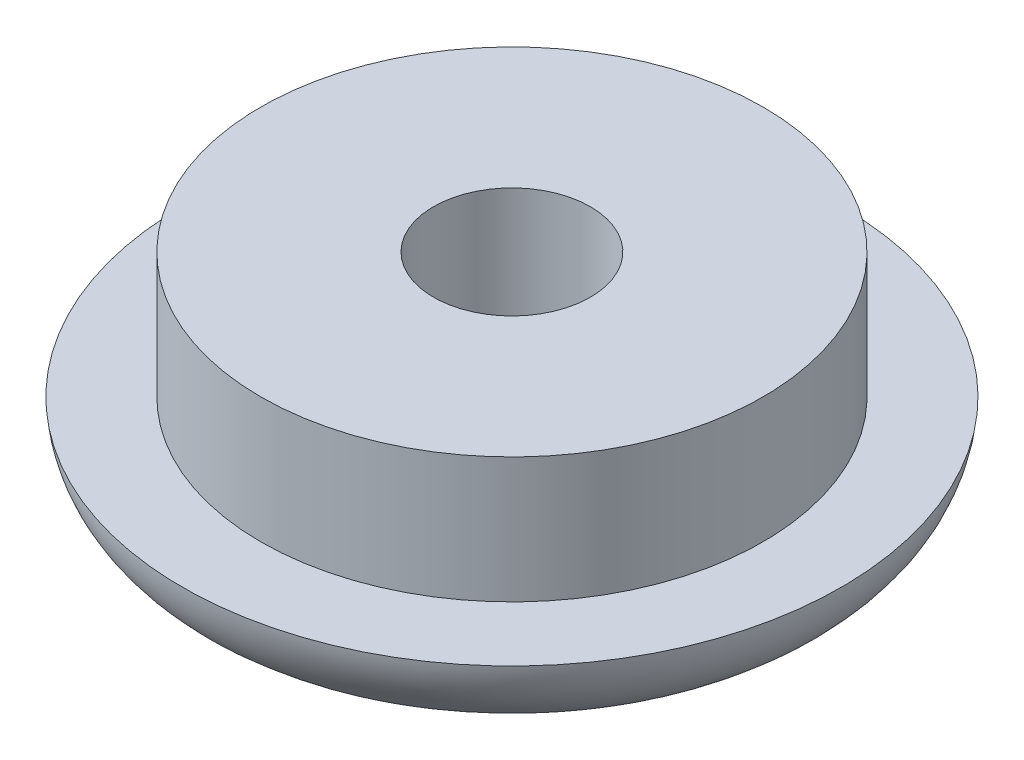
ISO-10303-21;
HEADER;
FILE_DESCRIPTION(('STEP AP214'),'2;1');
FILE_NAME('part.step','',(''),(''),'','','');
FILE_SCHEMA(('AUTOMOTIVE_DESIGN { 1 0 10303 214 1 1 1 1 }'));
ENDSEC;
DATA;
#1=APPLICATION_CONTEXT('core data for automotive mechanical design processes');
#2=APPLICATION_PROTOCOL_DEFINITION('international standard','automotive_design',2000,#1);
#3=PRODUCT_CONTEXT('',#1,'mechanical');
#4=PRODUCT('Part','Part','',(#3));
#5=PRODUCT_RELATED_PRODUCT_CATEGORY('part','',(#4));
#6=PRODUCT_DEFINITION_FORMATION('','',#4);
#7=PRODUCT_DEFINITION_CONTEXT('part definition',#1,'design');
#8=PRODUCT_DEFINITION('design','',#6,#7);
#9=PRODUCT_DEFINITION_SHAPE('','',#8);
#10=(LENGTH_UNIT() NAMED_UNIT(*) SI_UNIT(.MILLI.,.METRE.));
#11=(NAMED_UNIT(*) PLANE_ANGLE_UNIT() SI_UNIT($,.RADIAN.));
#12=(NAMED_UNIT(*) SI_UNIT($,.STERADIAN.) SOLID_ANGLE_UNIT());
#13=UNCERTAINTY_MEASURE_WITH_UNIT(LENGTH_MEASURE(1.E-05),#10,'distance_accuracy_value','');
#14=(GEOMETRIC_REPRESENTATION_CONTEXT(3) GLOBAL_UNCERTAINTY_ASSIGNED_CONTEXT((#13)) GLOBAL_UNIT_ASSIGNED_CONTEXT((#10,
#11,#12)) REPRESENTATION_CONTEXT('',''));
#15=CARTESIAN_POINT('',(0.,0.,0.));
#16=DIRECTION('',(0.,0.,1.));
#17=DIRECTION('',(1.,0.,0.));
#18=AXIS2_PLACEMENT_3D('',#15,#16,#17);
#19=CARTESIAN_POINT('',(0.,0.,0.));
#20=DIRECTION('',(0.,-1.,0.));
#21=DIRECTION('',(0.,0.,-1.));
#22=AXIS2_PLACEMENT_3D('',#19,#20,#21);
#23=CYLINDRICAL_SURFACE('',#22,2.5);
#24=CARTESIAN_POINT('',(0.,3.00000000000001,0.));
#25=DIRECTION('',(0.,-1.,0.));
#26=DIRECTION('',(0.,0.,-1.));
#27=AXIS2_PLACEMENT_3D('',#24,#25,#26);
#28=CIRCLE('',#27,2.5);
#29=CARTESIAN_POINT('',(0.,3.00000000000001,-2.5));
#30=VERTEX_POINT('',#29);
#31=EDGE_CURVE('E86',#30,#30,#28,.T.);
#32=ORIENTED_EDGE('',*,*,#31,.F.);
#33=EDGE_LOOP('',(#32));
#34=FACE_BOUND('',#33,.T.);
#35=CARTESIAN_POINT('',(0.,0.,0.));
#36=DIRECTION('',(0.,-1.,0.));
#37=DIRECTION('',(0.,0.,-1.));
#38=AXIS2_PLACEMENT_3D('',#35,#36,#37);
#39=CIRCLE('',#38,2.5);
#40=CARTESIAN_POINT('',(0.,0.,-2.5));
#41=VERTEX_POINT('',#40);
#42=EDGE_CURVE('E11',#41,#41,#39,.T.);
#43=ORIENTED_EDGE('',*,*,#42,.T.);
#44=EDGE_LOOP('',(#43));
#45=FACE_BOUND('',#44,.T.);
#46=ADVANCED_FACE('F33',(#34,#45),#23,.F.);
#47=CARTESIAN_POINT('',(-2.5,0.,0.));
#48=DIRECTION('',(0.,1.,0.));
#49=DIRECTION('',(0.,0.,1.));
#50=AXIS2_PLACEMENT_3D('',#47,#48,#49);
#51=PLANE('',#50);
#52=CARTESIAN_POINT('',(-12.5,0.,0.));
#53=DIRECTION('',(0.,-1.,0.));
#54=DIRECTION('',(0.,0.,-1.));
#55=AXIS2_PLACEMENT_3D('',#52,#53,#54);
#56=CIRCLE('',#55,1.25);
#57=CARTESIAN_POINT('',(-12.5,0.,-1.25));
#58=VERTEX_POINT('',#57);
#59=EDGE_CURVE('E64',#58,#58,#56,.T.);
#60=ORIENTED_EDGE('',*,*,#59,.F.);
#61=EDGE_LOOP('',(#60));
#62=FACE_BOUND('',#61,.T.);
#63=CARTESIAN_POINT('',(0.,0.,-9.5));
#64=DIRECTION('',(0.,-1.,0.));
#65=DIRECTION('',(0.,0.,-1.));
#66=AXIS2_PLACEMENT_3D('',#63,#64,#65);
#67=CIRCLE('',#66,1.25);
#68=CARTESIAN_POINT('',(0.,0.,-10.75));
#69=VERTEX_POINT('',#68);
#70=EDGE_CURVE('E63',#69,#69,#67,.T.);
#71=ORIENTED_EDGE('',*,*,#70,.F.);
#72=EDGE_LOOP('',(#71));
#73=FACE_BOUND('',#72,.T.);
#74=CARTESIAN_POINT('',(12.5,0.,0.));
#75=DIRECTION('',(0.,-1.,0.));
#76=DIRECTION('',(0.,0.,-1.));
#77=AXIS2_PLACEMENT_3D('',#74,#75,#76);
#78=CIRCLE('',#77,1.25);
#79=CARTESIAN_POINT('',(12.5,0.,-1.25));
#80=VERTEX_POINT('',#79);
#81=EDGE_CURVE('E74',#80,#80,#78,.T.);
#82=ORIENTED_EDGE('',*,*,#81,.F.);
#83=EDGE_LOOP('',(#82));
#84=FACE_BOUND('',#83,.T.);
#85=CARTESIAN_POINT('',(0.,0.,9.5));
#86=DIRECTION('',(0.,-1.,0.));
#87=DIRECTION('',(0.,0.,-1.));
#88=AXIS2_PLACEMENT_3D('',#85,#86,#87);
#89=CIRCLE('',#88,1.25);
#90=CARTESIAN_POINT('',(0.,0.,8.25));
#91=VERTEX_POINT('',#90);
#92=EDGE_CURVE('E80',#91,#91,#89,.T.);
#93=ORIENTED_EDGE('',*,*,#92,.F.);
#94=EDGE_LOOP('',(#93));
#95=FACE_BOUND('',#94,.T.);
#96=ORIENTED_EDGE('',*,*,#42,.F.);
#97=EDGE_LOOP('',(#96));
#98=FACE_BOUND('',#97,.T.);
#99=CARTESIAN_POINT('',(0.,0.,0.));
#100=DIRECTION('',(0.,-1.,0.));
#101=DIRECTION('',(0.,0.,-1.));
#102=AXIS2_PLACEMENT_3D('',#99,#100,#101);
#103=CIRCLE('',#102,15.);
#104=CARTESIAN_POINT('',(0.,0.,-15.));
#105=VERTEX_POINT('',#104);
#106=EDGE_CURVE('E40',#105,#105,#103,.T.);
#107=ORIENTED_EDGE('',*,*,#106,.T.);
#108=EDGE_LOOP('',(#107));
#109=FACE_BOUND('',#108,.T.);
#110=ADVANCED_FACE('F106',(#62,#73,#84,#95,#98,#109),#51,.F.);
#111=CARTESIAN_POINT('',(0.,6.02272727272727,0.));
#112=DIRECTION('',(0.,-1.,0.));
#113=DIRECTION('',(0.,0.,-1.));
#114=AXIS2_PLACEMENT_3D('',#111,#112,#113);
#115=TOROIDAL_SURFACE('',#114,15.,6.02272727272727);
#116=ORIENTED_EDGE('',*,*,#106,.F.);
#117=EDGE_LOOP('',(#116));
#118=FACE_BOUND('',#117,.T.);
#119=CARTESIAN_POINT('',(0.,5.5,0.));
#120=DIRECTION('',(0.,-1.,0.));
#121=DIRECTION('',(0.,0.,-1.));
#122=AXIS2_PLACEMENT_3D('',#119,#120,#121);
#123=CIRCLE('',#122,21.);
#124=CARTESIAN_POINT('',(0.,5.5,-21.));
#125=VERTEX_POINT('',#124);
#126=EDGE_CURVE('E101',#125,#125,#123,.T.);
#127=ORIENTED_EDGE('',*,*,#126,.T.);
#128=EDGE_LOOP('',(#127));
#129=FACE_BOUND('',#128,.T.);
#130=ADVANCED_FACE('F108',(#118,#129),#115,.T.);
#131=CARTESIAN_POINT('',(-16.,5.5,0.));
#132=DIRECTION('',(0.,-1.,0.));
#133=DIRECTION('',(0.,0.,-1.));
#134=AXIS2_PLACEMENT_3D('',#131,#132,#133);
#135=PLANE('',#134);
#136=ORIENTED_EDGE('',*,*,#126,.F.);
#137=EDGE_LOOP('',(#136));
#138=FACE_BOUND('',#137,.T.);
#139=CARTESIAN_POINT('',(0.,5.5,0.));
#140=DIRECTION('',(0.,-1.,0.));
#141=DIRECTION('',(0.,0.,-1.));
#142=AXIS2_PLACEMENT_3D('',#139,#140,#141);
#143=CIRCLE('',#142,16.);
#144=CARTESIAN_POINT('',(0.,5.5,-16.));
#145=VERTEX_POINT('',#144);
#146=EDGE_CURVE('E98',#145,#145,#143,.T.);
#147=ORIENTED_EDGE('',*,*,#146,.T.);
#148=EDGE_LOOP('',(#147));
#149=FACE_BOUND('',#148,.T.);
#150=ADVANCED_FACE('F111',(#138,#149),#135,.F.);
#151=CARTESIAN_POINT('',(0.,0.,0.));
#152=DIRECTION('',(0.,-1.,0.));
#153=DIRECTION('',(0.,0.,-1.));
#154=AXIS2_PLACEMENT_3D('',#151,#152,#153);
#155=CYLINDRICAL_SURFACE('',#154,16.);
#156=ORIENTED_EDGE('',*,*,#146,.F.);
#157=EDGE_LOOP('',(#156));
#158=FACE_BOUND('',#157,.T.);
#159=CARTESIAN_POINT('',(0.,13.5,0.));
#160=DIRECTION('',(0.,-1.,0.));
#161=DIRECTION('',(0.,0.,-1.));
#162=AXIS2_PLACEMENT_3D('',#159,#160,#161);
#163=CIRCLE('',#162,16.);
#164=CARTESIAN_POINT('',(0.,13.5,-16.));
#165=VERTEX_POINT('',#164);
#166=EDGE_CURVE('E95',#165,#165,#163,.T.);
#167=ORIENTED_EDGE('',*,*,#166,.T.);
#168=EDGE_LOOP('',(#167));
#169=FACE_BOUND('',#168,.T.);
#170=ADVANCED_FACE('F117',(#158,#169),#155,.T.);
#171=CARTESIAN_POINT('',(-5.,13.5,0.));
#172=DIRECTION('',(0.,-1.,0.));
#173=DIRECTION('',(0.,0.,-1.));
#174=AXIS2_PLACEMENT_3D('',#171,#172,#173);
#175=PLANE('',#174);
#176=ORIENTED_EDGE('',*,*,#166,.F.);
#177=EDGE_LOOP('',(#176));
#178=FACE_BOUND('',#177,.T.);
#179=CARTESIAN_POINT('',(0.,13.5,0.));
#180=DIRECTION('',(0.,-1.,0.));
#181=DIRECTION('',(0.,0.,-1.));
#182=AXIS2_PLACEMENT_3D('',#179,#180,#181);
#183=CIRCLE('',#182,5.);
#184=CARTESIAN_POINT('',(0.,13.5,-5.));
#185=VERTEX_POINT('',#184);
#186=EDGE_CURVE('E92',#185,#185,#183,.T.);
#187=ORIENTED_EDGE('',*,*,#186,.T.);
#188=EDGE_LOOP('',(#187));
#189=FACE_BOUND('',#188,.T.);
#190=ADVANCED_FACE('F123',(#178,#189),#175,.F.);
#191=CARTESIAN_POINT('',(0.,0.,0.));
#192=DIRECTION('',(0.,-1.,0.));
#193=DIRECTION('',(0.,0.,-1.));
#194=AXIS2_PLACEMENT_3D('',#191,#192,#193);
#195=CYLINDRICAL_SURFACE('',#194,5.);
#196=ORIENTED_EDGE('',*,*,#186,.F.);
#197=EDGE_LOOP('',(#196));
#198=FACE_BOUND('',#197,.T.);
#199=CARTESIAN_POINT('',(0.,5.5,0.));
#200=DIRECTION('',(0.,-1.,0.));
#201=DIRECTION('',(0.,0.,-1.));
#202=AXIS2_PLACEMENT_3D('',#199,#200,#201);
#203=CIRCLE('',#202,5.);
#204=CARTESIAN_POINT('',(0.,5.5,-5.));
#205=VERTEX_POINT('',#204);
#206=EDGE_CURVE('E89',#205,#205,#203,.T.);
#207=ORIENTED_EDGE('',*,*,#206,.T.);
#208=EDGE_LOOP('',(#207));
#209=FACE_BOUND('',#208,.T.);
#210=ADVANCED_FACE('F129',(#198,#209),#195,.F.);
#211=CARTESIAN_POINT('',(0.,3.00000000000001,0.));
#212=DIRECTION('',(0.,1.,0.));
#213=DIRECTION('',(0.,0.,1.));
#214=AXIS2_PLACEMENT_3D('',#211,#212,#213);
#215=CONICAL_SURFACE('',#214,2.5,0.78539816339745);
#216=ORIENTED_EDGE('',*,*,#206,.F.);
#217=EDGE_LOOP('',(#216));
#218=FACE_BOUND('',#217,.T.);
#219=ORIENTED_EDGE('',*,*,#31,.T.);
#220=EDGE_LOOP('',(#219));
#221=FACE_BOUND('',#220,.T.);
#222=ADVANCED_FACE('F135',(#218,#221),#215,.F.);
#223=CARTESIAN_POINT('',(0.,4.5,9.5));
#224=DIRECTION('',(0.,-1.,0.));
#225=DIRECTION('',(0.,0.,-1.));
#226=AXIS2_PLACEMENT_3D('',#223,#224,#225);
#227=CONICAL_SURFACE('',#226,1.25,1.02974425867665);
#228=CARTESIAN_POINT('',(0.,5.25107577378445,9.5));
#229=VERTEX_POINT('',#228);
#230=VERTEX_LOOP('',#229);
#231=FACE_BOUND('',#230,.T.);
#232=CARTESIAN_POINT('',(0.,4.5,9.5));
#233=DIRECTION('',(0.,-1.,0.));
#234=DIRECTION('',(0.,0.,-1.));
#235=AXIS2_PLACEMENT_3D('',#232,#233,#234);
#236=CIRCLE('',#235,1.25);
#237=CARTESIAN_POINT('',(0.,4.5,8.25));
#238=VERTEX_POINT('',#237);
#239=EDGE_CURVE('E83',#238,#238,#236,.T.);
#240=ORIENTED_EDGE('',*,*,#239,.T.);
#241=EDGE_LOOP('',(#240));
#242=FACE_BOUND('',#241,.T.);
#243=ADVANCED_FACE('F141',(#231,#242),#227,.F.);
#244=CARTESIAN_POINT('',(0.,0.,9.5));
#245=DIRECTION('',(0.,-1.,0.));
#246=DIRECTION('',(0.,0.,-1.));
#247=AXIS2_PLACEMENT_3D('',#244,#245,#246);
#248=CYLINDRICAL_SURFACE('',#247,1.25);
#249=ORIENTED_EDGE('',*,*,#239,.F.);
#250=EDGE_LOOP('',(#249));
#251=FACE_BOUND('',#250,.T.);
#252=ORIENTED_EDGE('',*,*,#92,.T.);
#253=EDGE_LOOP('',(#252));
#254=FACE_BOUND('',#253,.T.);
#255=ADVANCED_FACE('F160',(#251,#254),#248,.F.);
#256=CARTESIAN_POINT('',(12.5,4.5,0.));
#257=DIRECTION('',(0.,-1.,0.));
#258=DIRECTION('',(0.,0.,-1.));
#259=AXIS2_PLACEMENT_3D('',#256,#257,#258);
#260=CONICAL_SURFACE('',#259,1.25,1.02974425867665);
#261=CARTESIAN_POINT('',(12.5,5.25107577378445,0.));
#262=VERTEX_POINT('',#261);
#263=VERTEX_LOOP('',#262);
#264=FACE_BOUND('',#263,.T.);
#265=CARTESIAN_POINT('',(12.5,4.5,0.));
#266=DIRECTION('',(0.,-1.,0.));
#267=DIRECTION('',(0.,0.,-1.));
#268=AXIS2_PLACEMENT_3D('',#265,#266,#267);
#269=CIRCLE('',#268,1.25);
#270=CARTESIAN_POINT('',(12.5,4.5,-1.25));
#271=VERTEX_POINT('',#270);
#272=EDGE_CURVE('E77',#271,#271,#269,.T.);
#273=ORIENTED_EDGE('',*,*,#272,.T.);
#274=EDGE_LOOP('',(#273));
#275=FACE_BOUND('',#274,.T.);
#276=ADVANCED_FACE('F163',(#264,#275),#260,.F.);
#277=CARTESIAN_POINT('',(12.5,0.,0.));
#278=DIRECTION('',(0.,-1.,0.));
#279=DIRECTION('',(0.,0.,-1.));
#280=AXIS2_PLACEMENT_3D('',#277,#278,#279);
#281=CYLINDRICAL_SURFACE('',#280,1.25);
#282=ORIENTED_EDGE('',*,*,#272,.F.);
#283=EDGE_LOOP('',(#282));
#284=FACE_BOUND('',#283,.T.);
#285=ORIENTED_EDGE('',*,*,#81,.T.);
#286=EDGE_LOOP('',(#285));
#287=FACE_BOUND('',#286,.T.);
#288=ADVANCED_FACE('F167',(#284,#287),#281,.F.);
#289=CARTESIAN_POINT('',(0.,4.5,-9.5));
#290=DIRECTION('',(0.,-1.,0.));
#291=DIRECTION('',(0.,0.,-1.));
#292=AXIS2_PLACEMENT_3D('',#289,#290,#291);
#293=CONICAL_SURFACE('',#292,1.25,1.02974425867665);
#294=CARTESIAN_POINT('',(0.,5.25107577378445,-9.5));
#295=VERTEX_POINT('',#294);
#296=VERTEX_LOOP('',#295);
#297=FACE_BOUND('',#296,.T.);
#298=CARTESIAN_POINT('',(0.,4.5,-9.5));
#299=DIRECTION('',(0.,-1.,0.));
#300=DIRECTION('',(0.,0.,-1.));
#301=AXIS2_PLACEMENT_3D('',#298,#299,#300);
#302=CIRCLE('',#301,1.25);
#303=CARTESIAN_POINT('',(0.,4.5,-10.75));
#304=VERTEX_POINT('',#303);
#305=EDGE_CURVE('E67',#304,#304,#302,.T.);
#306=ORIENTED_EDGE('',*,*,#305,.T.);
#307=EDGE_LOOP('',(#306));
#308=FACE_BOUND('',#307,.T.);
#309=ADVANCED_FACE('F170',(#297,#308),#293,.F.);
#310=CARTESIAN_POINT('',(0.,0.,-9.5));
#311=DIRECTION('',(0.,-1.,0.));
#312=DIRECTION('',(0.,0.,-1.));
#313=AXIS2_PLACEMENT_3D('',#310,#311,#312);
#314=CYLINDRICAL_SURFACE('',#313,1.25);
#315=ORIENTED_EDGE('',*,*,#305,.F.);
#316=EDGE_LOOP('',(#315));
#317=FACE_BOUND('',#316,.T.);
#318=ORIENTED_EDGE('',*,*,#70,.T.);
#319=EDGE_LOOP('',(#318));
#320=FACE_BOUND('',#319,.T.);
#321=ADVANCED_FACE('F57',(#317,#320),#314,.F.);
#322=CARTESIAN_POINT('',(-12.5,4.5,0.));
#323=DIRECTION('',(0.,-1.,0.));
#324=DIRECTION('',(0.,0.,-1.));
#325=AXIS2_PLACEMENT_3D('',#322,#323,#324);
#326=CONICAL_SURFACE('',#325,1.25,1.02974425867665);
#327=CARTESIAN_POINT('',(-12.5,5.25107577378445,0.));
#328=VERTEX_POINT('',#327);
#329=VERTEX_LOOP('',#328);
#330=FACE_BOUND('',#329,.T.);
#331=CARTESIAN_POINT('',(-12.5,4.5,0.));
#332=DIRECTION('',(0.,-1.,0.));
#333=DIRECTION('',(0.,0.,-1.));
#334=AXIS2_PLACEMENT_3D('',#331,#332,#333);
#335=CIRCLE('',#334,1.25);
#336=CARTESIAN_POINT('',(-12.5,4.5,-1.25));
#337=VERTEX_POINT('',#336);
#338=EDGE_CURVE('E61',#337,#337,#335,.T.);
#339=ORIENTED_EDGE('',*,*,#338,.T.);
#340=EDGE_LOOP('',(#339));
#341=FACE_BOUND('',#340,.T.);
#342=ADVANCED_FACE('F53',(#330,#341),#326,.F.);
#343=CARTESIAN_POINT('',(-12.5,0.,0.));
#344=DIRECTION('',(0.,-1.,0.));
#345=DIRECTION('',(0.,0.,-1.));
#346=AXIS2_PLACEMENT_3D('',#343,#344,#345);
#347=CYLINDRICAL_SURFACE('',#346,1.25);
#348=ORIENTED_EDGE('',*,*,#338,.F.);
#349=EDGE_LOOP('',(#348));
#350=FACE_BOUND('',#349,.T.);
#351=ORIENTED_EDGE('',*,*,#59,.T.);
#352=EDGE_LOOP('',(#351));
#353=FACE_BOUND('',#352,.T.);
#354=ADVANCED_FACE('F56',(#350,#353),#347,.F.);
#355=CLOSED_SHELL('',(#46,#110,#130,#150,#170,#190,#210,#222,#243,#255,#276,#288,#309,#321,#342,#354));
#356=MANIFOLD_SOLID_BREP('B2',#355);
#357=ADVANCED_BREP_SHAPE_REPRESENTATION('',(#18,#356),#14);
#358=SHAPE_DEFINITION_REPRESENTATION(#9,#357);
ENDSEC;
END-ISO-10303-21;
